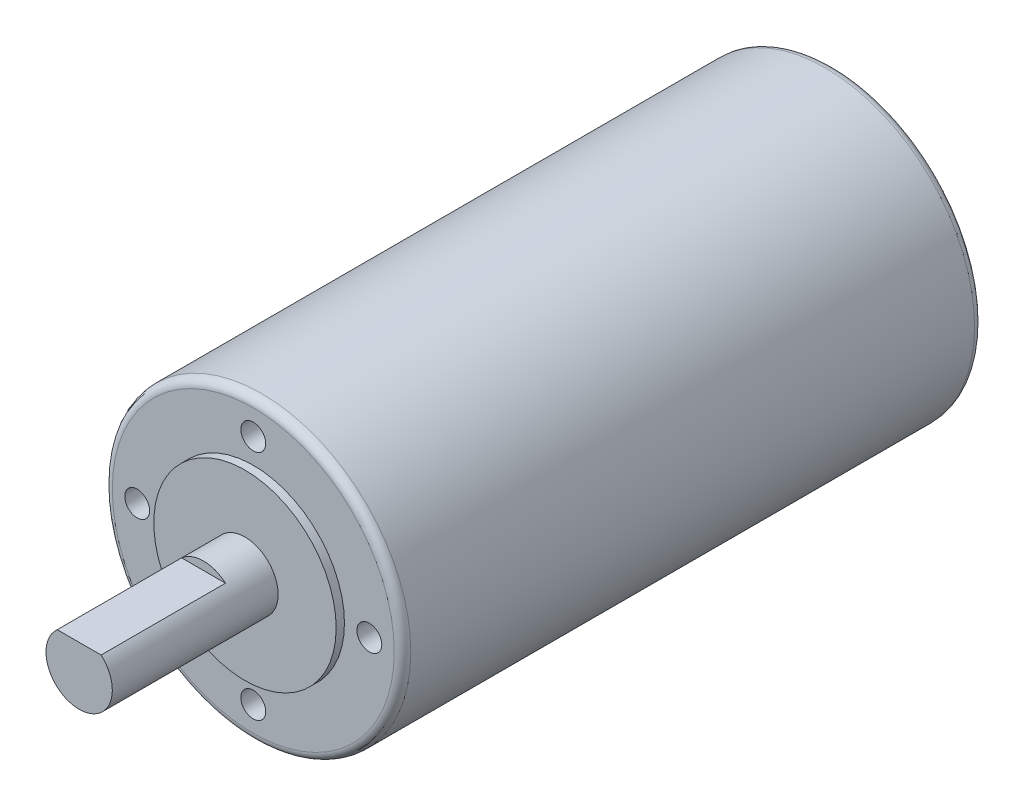
ISO-10303-21;
HEADER;
FILE_DESCRIPTION(('STEP AP214'),'2;1');
FILE_NAME('part.step','',(''),(''),'','','');
FILE_SCHEMA(('AUTOMOTIVE_DESIGN { 1 0 10303 214 1 1 1 1 }'));
ENDSEC;
DATA;
#1=APPLICATION_CONTEXT('core data for automotive mechanical design processes');
#2=APPLICATION_PROTOCOL_DEFINITION('international standard','automotive_design',2000,#1);
#3=PRODUCT_CONTEXT('',#1,'mechanical');
#4=PRODUCT('Part','Part','',(#3));
#5=PRODUCT_RELATED_PRODUCT_CATEGORY('part','',(#4));
#6=PRODUCT_DEFINITION_FORMATION('','',#4);
#7=PRODUCT_DEFINITION_CONTEXT('part definition',#1,'design');
#8=PRODUCT_DEFINITION('design','',#6,#7);
#9=PRODUCT_DEFINITION_SHAPE('','',#8);
#10=(LENGTH_UNIT() NAMED_UNIT(*) SI_UNIT(.MILLI.,.METRE.));
#11=(NAMED_UNIT(*) PLANE_ANGLE_UNIT() SI_UNIT($,.RADIAN.));
#12=(NAMED_UNIT(*) SI_UNIT($,.STERADIAN.) SOLID_ANGLE_UNIT());
#13=UNCERTAINTY_MEASURE_WITH_UNIT(LENGTH_MEASURE(1.E-05),#10,'distance_accuracy_value','');
#14=(GEOMETRIC_REPRESENTATION_CONTEXT(3) GLOBAL_UNCERTAINTY_ASSIGNED_CONTEXT((#13)) GLOBAL_UNIT_ASSIGNED_CONTEXT((#10,
#11,#12)) REPRESENTATION_CONTEXT('',''));
#15=CARTESIAN_POINT('',(0.,0.,0.));
#16=DIRECTION('',(0.,0.,1.));
#17=DIRECTION('',(1.,0.,0.));
#18=AXIS2_PLACEMENT_3D('',#15,#16,#17);
#19=CARTESIAN_POINT('',(0.,0.,-20.));
#20=DIRECTION('',(0.,0.,1.));
#21=DIRECTION('',(1.,0.,0.));
#22=AXIS2_PLACEMENT_3D('',#19,#20,#21);
#23=CYLINDRICAL_SURFACE('',#22,18.);
#24=CARTESIAN_POINT('',(0.,0.,-1.));
#25=DIRECTION('',(0.,0.,1.));
#26=DIRECTION('',(1.,0.,0.));
#27=AXIS2_PLACEMENT_3D('',#24,#25,#26);
#28=CIRCLE('',#27,18.);
#29=CARTESIAN_POINT('',(18.,0.,-1.));
#30=VERTEX_POINT('',#29);
#31=EDGE_CURVE('E50',#30,#30,#28,.F.);
#32=ORIENTED_EDGE('',*,*,#31,.T.);
#33=EDGE_LOOP('',(#32));
#34=FACE_BOUND('',#33,.T.);
#35=CARTESIAN_POINT('',(0.,0.,-69.));
#36=DIRECTION('',(0.,0.,-1.));
#37=DIRECTION('',(-1.,0.,0.));
#38=AXIS2_PLACEMENT_3D('',#35,#36,#37);
#39=CIRCLE('',#38,18.);
#40=CARTESIAN_POINT('',(-18.,0.,-69.));
#41=VERTEX_POINT('',#40);
#42=EDGE_CURVE('E144',#41,#41,#39,.F.);
#43=ORIENTED_EDGE('',*,*,#42,.T.);
#44=EDGE_LOOP('',(#43));
#45=FACE_BOUND('',#44,.T.);
#46=ADVANCED_FACE('F41',(#34,#45),#23,.T.);
#47=CARTESIAN_POINT('',(0.,0.,0.));
#48=DIRECTION('',(0.,0.,1.));
#49=DIRECTION('',(1.,0.,0.));
#50=AXIS2_PLACEMENT_3D('',#47,#48,#49);
#51=PLANE('',#50);
#52=CARTESIAN_POINT('',(0.,0.,0.));
#53=DIRECTION('',(0.,0.,1.));
#54=DIRECTION('',(1.,0.,0.));
#55=AXIS2_PLACEMENT_3D('',#52,#53,#54);
#56=CIRCLE('',#55,17.);
#57=CARTESIAN_POINT('',(17.,0.,0.));
#58=VERTEX_POINT('',#57);
#59=EDGE_CURVE('E97',#58,#58,#56,.T.);
#60=ORIENTED_EDGE('',*,*,#59,.T.);
#61=EDGE_LOOP('',(#60));
#62=FACE_BOUND('',#61,.T.);
#63=CARTESIAN_POINT('',(0.,0.,0.));
#64=DIRECTION('',(0.,0.,1.));
#65=DIRECTION('',(1.,0.,0.));
#66=AXIS2_PLACEMENT_3D('',#63,#64,#65);
#67=CIRCLE('',#66,11.);
#68=CARTESIAN_POINT('',(11.,0.,0.));
#69=VERTEX_POINT('',#68);
#70=EDGE_CURVE('E85',#69,#69,#67,.T.);
#71=ORIENTED_EDGE('',*,*,#70,.F.);
#72=EDGE_LOOP('',(#71));
#73=FACE_BOUND('',#72,.T.);
#74=CARTESIAN_POINT('',(-13.9999999999996,-3.97046679266253E-13,0.));
#75=DIRECTION('',(0.,0.,1.));
#76=DIRECTION('',(1.,0.,0.));
#77=AXIS2_PLACEMENT_3D('',#74,#75,#76);
#78=CIRCLE('',#77,1.50000000000064);
#79=CARTESIAN_POINT('',(-12.499999999999,-3.97046679266253E-13,0.));
#80=VERTEX_POINT('',#79);
#81=EDGE_CURVE('E106',#80,#80,#78,.T.);
#82=ORIENTED_EDGE('',*,*,#81,.F.);
#83=EDGE_LOOP('',(#82));
#84=FACE_BOUND('',#83,.T.);
#85=CARTESIAN_POINT('',(7.90664347494893E-13,-14.,0.));
#86=DIRECTION('',(0.,0.,1.));
#87=DIRECTION('',(1.,0.,0.));
#88=AXIS2_PLACEMENT_3D('',#85,#86,#87);
#89=CIRCLE('',#88,1.50000000000085);
#90=CARTESIAN_POINT('',(1.50000000000164,-14.,0.));
#91=VERTEX_POINT('',#90);
#92=EDGE_CURVE('E115',#91,#91,#89,.T.);
#93=ORIENTED_EDGE('',*,*,#92,.F.);
#94=EDGE_LOOP('',(#93));
#95=FACE_BOUND('',#94,.T.);
#96=CARTESIAN_POINT('',(14.0000000000004,3.95332173747447E-13,0.));
#97=DIRECTION('',(0.,0.,1.));
#98=DIRECTION('',(1.,0.,0.));
#99=AXIS2_PLACEMENT_3D('',#96,#97,#98);
#100=CIRCLE('',#99,1.50000000000031);
#101=CARTESIAN_POINT('',(15.5000000000007,3.95332173747447E-13,0.));
#102=VERTEX_POINT('',#101);
#103=EDGE_CURVE('E123',#102,#102,#100,.T.);
#104=ORIENTED_EDGE('',*,*,#103,.F.);
#105=EDGE_LOOP('',(#104));
#106=FACE_BOUND('',#105,.T.);
#107=CARTESIAN_POINT('',(0.,14.,0.));
#108=DIRECTION('',(0.,0.,1.));
#109=DIRECTION('',(1.,0.,0.));
#110=AXIS2_PLACEMENT_3D('',#107,#108,#109);
#111=CIRCLE('',#110,1.5);
#112=CARTESIAN_POINT('',(1.5,14.,0.));
#113=VERTEX_POINT('',#112);
#114=EDGE_CURVE('E131',#113,#113,#111,.T.);
#115=ORIENTED_EDGE('',*,*,#114,.F.);
#116=EDGE_LOOP('',(#115));
#117=FACE_BOUND('',#116,.T.);
#118=ADVANCED_FACE('F159',(#62,#73,#84,#95,#106,#117),#51,.T.);
#119=CARTESIAN_POINT('',(0.,14.,-20.));
#120=DIRECTION('',(0.,0.,1.));
#121=DIRECTION('',(1.,0.,0.));
#122=AXIS2_PLACEMENT_3D('',#119,#120,#121);
#123=CYLINDRICAL_SURFACE('',#122,1.5);
#124=CARTESIAN_POINT('',(0.,14.,-20.));
#125=DIRECTION('',(0.,0.,1.));
#126=DIRECTION('',(1.,0.,0.));
#127=AXIS2_PLACEMENT_3D('',#124,#125,#126);
#128=CIRCLE('',#127,1.5);
#129=CARTESIAN_POINT('',(1.5,14.,-20.));
#130=VERTEX_POINT('',#129);
#131=EDGE_CURVE('E110',#130,#130,#128,.T.);
#132=ORIENTED_EDGE('',*,*,#131,.F.);
#133=EDGE_LOOP('',(#132));
#134=FACE_BOUND('',#133,.T.);
#135=ORIENTED_EDGE('',*,*,#114,.T.);
#136=EDGE_LOOP('',(#135));
#137=FACE_BOUND('',#136,.T.);
#138=ADVANCED_FACE('F162',(#134,#137),#123,.F.);
#139=CARTESIAN_POINT('',(14.0000000000004,3.95332173747447E-13,-20.));
#140=DIRECTION('',(0.,0.,1.));
#141=DIRECTION('',(1.,0.,0.));
#142=AXIS2_PLACEMENT_3D('',#139,#140,#141);
#143=CYLINDRICAL_SURFACE('',#142,1.50000000000031);
#144=CARTESIAN_POINT('',(14.0000000000004,3.95332173747447E-13,-20.));
#145=DIRECTION('',(0.,0.,1.));
#146=DIRECTION('',(1.,0.,0.));
#147=AXIS2_PLACEMENT_3D('',#144,#145,#146);
#148=CIRCLE('',#147,1.50000000000031);
#149=CARTESIAN_POINT('',(15.5000000000007,3.95332173747447E-13,-20.));
#150=VERTEX_POINT('',#149);
#151=EDGE_CURVE('E127',#150,#150,#148,.T.);
#152=ORIENTED_EDGE('',*,*,#151,.F.);
#153=EDGE_LOOP('',(#152));
#154=FACE_BOUND('',#153,.T.);
#155=ORIENTED_EDGE('',*,*,#103,.T.);
#156=EDGE_LOOP('',(#155));
#157=FACE_BOUND('',#156,.T.);
#158=ADVANCED_FACE('F175',(#154,#157),#143,.F.);
#159=CARTESIAN_POINT('',(7.90664347494893E-13,-14.,-20.));
#160=DIRECTION('',(0.,0.,1.));
#161=DIRECTION('',(1.,0.,0.));
#162=AXIS2_PLACEMENT_3D('',#159,#160,#161);
#163=CYLINDRICAL_SURFACE('',#162,1.50000000000085);
#164=CARTESIAN_POINT('',(7.90664347494893E-13,-14.,-20.));
#165=DIRECTION('',(0.,0.,1.));
#166=DIRECTION('',(1.,0.,0.));
#167=AXIS2_PLACEMENT_3D('',#164,#165,#166);
#168=CIRCLE('',#167,1.50000000000085);
#169=CARTESIAN_POINT('',(1.50000000000164,-14.,-20.));
#170=VERTEX_POINT('',#169);
#171=EDGE_CURVE('E119',#170,#170,#168,.T.);
#172=ORIENTED_EDGE('',*,*,#171,.F.);
#173=EDGE_LOOP('',(#172));
#174=FACE_BOUND('',#173,.T.);
#175=ORIENTED_EDGE('',*,*,#92,.T.);
#176=EDGE_LOOP('',(#175));
#177=FACE_BOUND('',#176,.T.);
#178=ADVANCED_FACE('F181',(#174,#177),#163,.F.);
#179=CARTESIAN_POINT('',(-13.9999999999996,-3.97046679266253E-13,-20.));
#180=DIRECTION('',(0.,0.,1.));
#181=DIRECTION('',(1.,0.,0.));
#182=AXIS2_PLACEMENT_3D('',#179,#180,#181);
#183=CYLINDRICAL_SURFACE('',#182,1.50000000000064);
#184=CARTESIAN_POINT('',(-13.9999999999996,-3.97046679266253E-13,-20.));
#185=DIRECTION('',(0.,0.,1.));
#186=DIRECTION('',(1.,0.,0.));
#187=AXIS2_PLACEMENT_3D('',#184,#185,#186);
#188=CIRCLE('',#187,1.50000000000064);
#189=CARTESIAN_POINT('',(-12.499999999999,-3.97046679266253E-13,-20.));
#190=VERTEX_POINT('',#189);
#191=EDGE_CURVE('E111',#190,#190,#188,.T.);
#192=ORIENTED_EDGE('',*,*,#191,.F.);
#193=EDGE_LOOP('',(#192));
#194=FACE_BOUND('',#193,.T.);
#195=ORIENTED_EDGE('',*,*,#81,.T.);
#196=EDGE_LOOP('',(#195));
#197=FACE_BOUND('',#196,.T.);
#198=ADVANCED_FACE('F254',(#194,#197),#183,.F.);
#199=CARTESIAN_POINT('',(0.,0.,-20.));
#200=DIRECTION('',(0.,0.,-1.));
#201=DIRECTION('',(-1.,0.,0.));
#202=AXIS2_PLACEMENT_3D('',#199,#200,#201);
#203=PLANE('',#202);
#204=ORIENTED_EDGE('',*,*,#131,.T.);
#205=EDGE_LOOP('',(#204));
#206=FACE_BOUND('',#205,.T.);
#207=ADVANCED_FACE('F253',(#206),#203,.F.);
#208=ORIENTED_EDGE('',*,*,#151,.T.);
#209=EDGE_LOOP('',(#208));
#210=FACE_BOUND('',#209,.T.);
#211=ADVANCED_FACE('F266',(#210),#203,.F.);
#212=ORIENTED_EDGE('',*,*,#171,.T.);
#213=EDGE_LOOP('',(#212));
#214=FACE_BOUND('',#213,.T.);
#215=ADVANCED_FACE('F251',(#214),#203,.F.);
#216=ORIENTED_EDGE('',*,*,#191,.T.);
#217=EDGE_LOOP('',(#216));
#218=FACE_BOUND('',#217,.T.);
#219=ADVANCED_FACE('F207',(#218),#203,.F.);
#220=CARTESIAN_POINT('',(0.,0.,-70.));
#221=DIRECTION('',(0.,0.,-1.));
#222=DIRECTION('',(-1.,0.,0.));
#223=AXIS2_PLACEMENT_3D('',#220,#221,#222);
#224=PLANE('',#223);
#225=CARTESIAN_POINT('',(0.,0.,-70.));
#226=DIRECTION('',(0.,0.,-1.));
#227=DIRECTION('',(-1.,0.,0.));
#228=AXIS2_PLACEMENT_3D('',#225,#226,#227);
#229=CIRCLE('',#228,17.);
#230=CARTESIAN_POINT('',(-17.,0.,-70.));
#231=VERTEX_POINT('',#230);
#232=EDGE_CURVE('E11',#231,#231,#229,.T.);
#233=ORIENTED_EDGE('',*,*,#232,.T.);
#234=EDGE_LOOP('',(#233));
#235=FACE_BOUND('',#234,.T.);
#236=CARTESIAN_POINT('',(0.,0.,-70.));
#237=DIRECTION('',(0.,0.,-1.));
#238=DIRECTION('',(-1.,0.,0.));
#239=AXIS2_PLACEMENT_3D('',#236,#237,#238);
#240=CIRCLE('',#239,6.5);
#241=CARTESIAN_POINT('',(-6.5,0.,-70.));
#242=VERTEX_POINT('',#241);
#243=EDGE_CURVE('E98',#242,#242,#240,.T.);
#244=ORIENTED_EDGE('',*,*,#243,.F.);
#245=EDGE_LOOP('',(#244));
#246=FACE_BOUND('',#245,.T.);
#247=ADVANCED_FACE('F201',(#235,#246),#224,.T.);
#248=CARTESIAN_POINT('',(0.,0.,-73.7));
#249=DIRECTION('',(0.,0.,1.));
#250=DIRECTION('',(1.,0.,0.));
#251=AXIS2_PLACEMENT_3D('',#248,#249,#250);
#252=CYLINDRICAL_SURFACE('',#251,6.5);
#253=CARTESIAN_POINT('',(0.,0.,-73.7));
#254=DIRECTION('',(0.,0.,-1.));
#255=DIRECTION('',(-1.,0.,0.));
#256=AXIS2_PLACEMENT_3D('',#253,#254,#255);
#257=CIRCLE('',#256,6.5);
#258=CARTESIAN_POINT('',(-6.5,0.,-73.7));
#259=VERTEX_POINT('',#258);
#260=EDGE_CURVE('E101',#259,#259,#257,.T.);
#261=ORIENTED_EDGE('',*,*,#260,.F.);
#262=EDGE_LOOP('',(#261));
#263=FACE_BOUND('',#262,.T.);
#264=ORIENTED_EDGE('',*,*,#243,.T.);
#265=EDGE_LOOP('',(#264));
#266=FACE_BOUND('',#265,.T.);
#267=ADVANCED_FACE('F206',(#263,#266),#252,.T.);
#268=CARTESIAN_POINT('',(0.,0.,-73.7));
#269=DIRECTION('',(0.,0.,-1.));
#270=DIRECTION('',(-1.,0.,0.));
#271=AXIS2_PLACEMENT_3D('',#268,#269,#270);
#272=PLANE('',#271);
#273=ORIENTED_EDGE('',*,*,#260,.T.);
#274=EDGE_LOOP('',(#273));
#275=FACE_BOUND('',#274,.T.);
#276=ADVANCED_FACE('F238',(#275),#272,.T.);
#277=CARTESIAN_POINT('',(0.,0.,1.));
#278=DIRECTION('',(0.,0.,-1.));
#279=DIRECTION('',(-1.,0.,0.));
#280=AXIS2_PLACEMENT_3D('',#277,#278,#279);
#281=CYLINDRICAL_SURFACE('',#280,11.);
#282=CARTESIAN_POINT('',(0.,0.,1.));
#283=DIRECTION('',(0.,0.,1.));
#284=DIRECTION('',(1.,0.,0.));
#285=AXIS2_PLACEMENT_3D('',#282,#283,#284);
#286=CIRCLE('',#285,11.);
#287=CARTESIAN_POINT('',(11.,0.,1.));
#288=VERTEX_POINT('',#287);
#289=EDGE_CURVE('E89',#288,#288,#286,.T.);
#290=ORIENTED_EDGE('',*,*,#289,.F.);
#291=EDGE_LOOP('',(#290));
#292=FACE_BOUND('',#291,.T.);
#293=ORIENTED_EDGE('',*,*,#70,.T.);
#294=EDGE_LOOP('',(#293));
#295=FACE_BOUND('',#294,.T.);
#296=ADVANCED_FACE('F244',(#292,#295),#281,.T.);
#297=CARTESIAN_POINT('',(0.,0.,1.));
#298=DIRECTION('',(0.,0.,1.));
#299=DIRECTION('',(1.,0.,0.));
#300=AXIS2_PLACEMENT_3D('',#297,#298,#299);
#301=PLANE('',#300);
#302=CARTESIAN_POINT('',(0.,0.,1.));
#303=DIRECTION('',(0.,0.,1.));
#304=DIRECTION('',(1.,0.,0.));
#305=AXIS2_PLACEMENT_3D('',#302,#303,#304);
#306=CIRCLE('',#305,4.);
#307=CARTESIAN_POINT('',(4.,0.,1.));
#308=VERTEX_POINT('',#307);
#309=EDGE_CURVE('E93',#308,#308,#306,.T.);
#310=ORIENTED_EDGE('',*,*,#309,.F.);
#311=EDGE_LOOP('',(#310));
#312=FACE_BOUND('',#311,.T.);
#313=ORIENTED_EDGE('',*,*,#289,.T.);
#314=EDGE_LOOP('',(#313));
#315=FACE_BOUND('',#314,.T.);
#316=ADVANCED_FACE('F333',(#312,#315),#301,.T.);
#317=CARTESIAN_POINT('',(0.,0.,21.));
#318=DIRECTION('',(0.,0.,-1.));
#319=DIRECTION('',(-1.,0.,0.));
#320=AXIS2_PLACEMENT_3D('',#317,#318,#319);
#321=CYLINDRICAL_SURFACE('',#320,4.);
#322=CARTESIAN_POINT('',(0.,0.,21.));
#323=DIRECTION('',(0.,0.,1.));
#324=DIRECTION('',(1.,0.,0.));
#325=AXIS2_PLACEMENT_3D('',#322,#323,#324);
#326=CIRCLE('',#325,4.);
#327=CARTESIAN_POINT('',(-2.64575131106459,3.,21.));
#328=VERTEX_POINT('',#327);
#329=CARTESIAN_POINT('',(2.64575131106459,3.,21.));
#330=VERTEX_POINT('',#329);
#331=EDGE_CURVE('E80',#328,#330,#326,.T.);
#332=ORIENTED_EDGE('',*,*,#331,.F.);
#333=DIRECTION('',(0.,0.,1.));
#334=VECTOR('',#333,1.);
#335=CARTESIAN_POINT('',(-2.64575131106459,3.,6.));
#336=LINE('',#335,#334);
#337=CARTESIAN_POINT('',(-2.64575131106459,3.,6.));
#338=VERTEX_POINT('',#337);
#339=EDGE_CURVE('E57',#338,#328,#336,.T.);
#340=ORIENTED_EDGE('',*,*,#339,.F.);
#341=CARTESIAN_POINT('',(0.,0.,6.));
#342=DIRECTION('',(0.,0.,1.));
#343=DIRECTION('',(1.,0.,0.));
#344=AXIS2_PLACEMENT_3D('',#341,#342,#343);
#345=CIRCLE('',#344,4.);
#346=CARTESIAN_POINT('',(2.64575131106459,3.,6.));
#347=VERTEX_POINT('',#346);
#348=EDGE_CURVE('E74',#347,#338,#345,.T.);
#349=ORIENTED_EDGE('',*,*,#348,.F.);
#350=DIRECTION('',(0.,0.,1.));
#351=VECTOR('',#350,1.);
#352=CARTESIAN_POINT('',(2.64575131106459,3.,6.));
#353=LINE('',#352,#351);
#354=EDGE_CURVE('E63',#347,#330,#353,.T.);
#355=ORIENTED_EDGE('',*,*,#354,.T.);
#356=EDGE_LOOP('',(#332,#340,#349,#355));
#357=FACE_BOUND('',#356,.T.);
#358=ORIENTED_EDGE('',*,*,#309,.T.);
#359=EDGE_LOOP('',(#358));
#360=FACE_BOUND('',#359,.T.);
#361=ADVANCED_FACE('F78',(#357,#360),#321,.T.);
#362=CARTESIAN_POINT('',(0.,0.,21.));
#363=DIRECTION('',(0.,0.,1.));
#364=DIRECTION('',(1.,0.,0.));
#365=AXIS2_PLACEMENT_3D('',#362,#363,#364);
#366=PLANE('',#365);
#367=DIRECTION('',(1.,0.,0.));
#368=VECTOR('',#367,1.);
#369=CARTESIAN_POINT('',(0.,3.,21.));
#370=LINE('',#369,#368);
#371=EDGE_CURVE('E68',#328,#330,#370,.T.);
#372=ORIENTED_EDGE('',*,*,#371,.F.);
#373=ORIENTED_EDGE('',*,*,#331,.T.);
#374=EDGE_LOOP('',(#372,#373));
#375=FACE_BOUND('',#374,.T.);
#376=ADVANCED_FACE('F83',(#375),#366,.T.);
#377=CARTESIAN_POINT('',(0.,3.,6.));
#378=DIRECTION('',(0.,-1.,0.));
#379=DIRECTION('',(0.,0.,-1.));
#380=AXIS2_PLACEMENT_3D('',#377,#378,#379);
#381=PLANE('',#380);
#382=ORIENTED_EDGE('',*,*,#371,.T.);
#383=ORIENTED_EDGE('',*,*,#354,.F.);
#384=DIRECTION('',(1.,0.,0.));
#385=VECTOR('',#384,1.);
#386=CARTESIAN_POINT('',(0.,3.,6.));
#387=LINE('',#386,#385);
#388=EDGE_CURVE('E378',#338,#347,#387,.T.);
#389=ORIENTED_EDGE('',*,*,#388,.F.);
#390=ORIENTED_EDGE('',*,*,#339,.T.);
#391=EDGE_LOOP('',(#382,#383,#389,#390));
#392=FACE_BOUND('',#391,.T.);
#393=ADVANCED_FACE('F69',(#392),#381,.F.);
#394=CARTESIAN_POINT('',(0.,0.,6.));
#395=DIRECTION('',(0.,0.,1.));
#396=DIRECTION('',(1.,0.,0.));
#397=AXIS2_PLACEMENT_3D('',#394,#395,#396);
#398=PLANE('',#397);
#399=ORIENTED_EDGE('',*,*,#348,.T.);
#400=ORIENTED_EDGE('',*,*,#388,.T.);
#401=EDGE_LOOP('',(#399,#400));
#402=FACE_BOUND('',#401,.T.);
#403=ADVANCED_FACE('F156',(#402),#398,.T.);
#404=CARTESIAN_POINT('',(0.,0.,-1.));
#405=DIRECTION('',(0.,0.,1.));
#406=DIRECTION('',(1.,0.,0.));
#407=AXIS2_PLACEMENT_3D('',#404,#405,#406);
#408=TOROIDAL_SURFACE('',#407,17.,1.);
#409=ORIENTED_EDGE('',*,*,#31,.F.);
#410=EDGE_LOOP('',(#409));
#411=FACE_BOUND('',#410,.T.);
#412=ORIENTED_EDGE('',*,*,#59,.F.);
#413=EDGE_LOOP('',(#412));
#414=FACE_BOUND('',#413,.T.);
#415=ADVANCED_FACE('F153',(#411,#414),#408,.T.);
#416=CARTESIAN_POINT('',(0.,0.,-69.));
#417=DIRECTION('',(0.,0.,-1.));
#418=DIRECTION('',(-1.,0.,0.));
#419=AXIS2_PLACEMENT_3D('',#416,#417,#418);
#420=TOROIDAL_SURFACE('',#419,17.,1.);
#421=ORIENTED_EDGE('',*,*,#42,.F.);
#422=EDGE_LOOP('',(#421));
#423=FACE_BOUND('',#422,.T.);
#424=ORIENTED_EDGE('',*,*,#232,.F.);
#425=EDGE_LOOP('',(#424));
#426=FACE_BOUND('',#425,.T.);
#427=ADVANCED_FACE('F43',(#423,#426),#420,.T.);
#428=CLOSED_SHELL('',(#46,#118,#138,#158,#178,#198,#207,#211,#215,#219,#247,#267,#276,#296,#316,
#361,#376,#393,#403,#415,#427));
#429=MANIFOLD_SOLID_BREP('B2',#428);
#430=ADVANCED_BREP_SHAPE_REPRESENTATION('',(#18,#429),#14);
#431=SHAPE_DEFINITION_REPRESENTATION(#9,#430);
ENDSEC;
END-ISO-10303-21;
